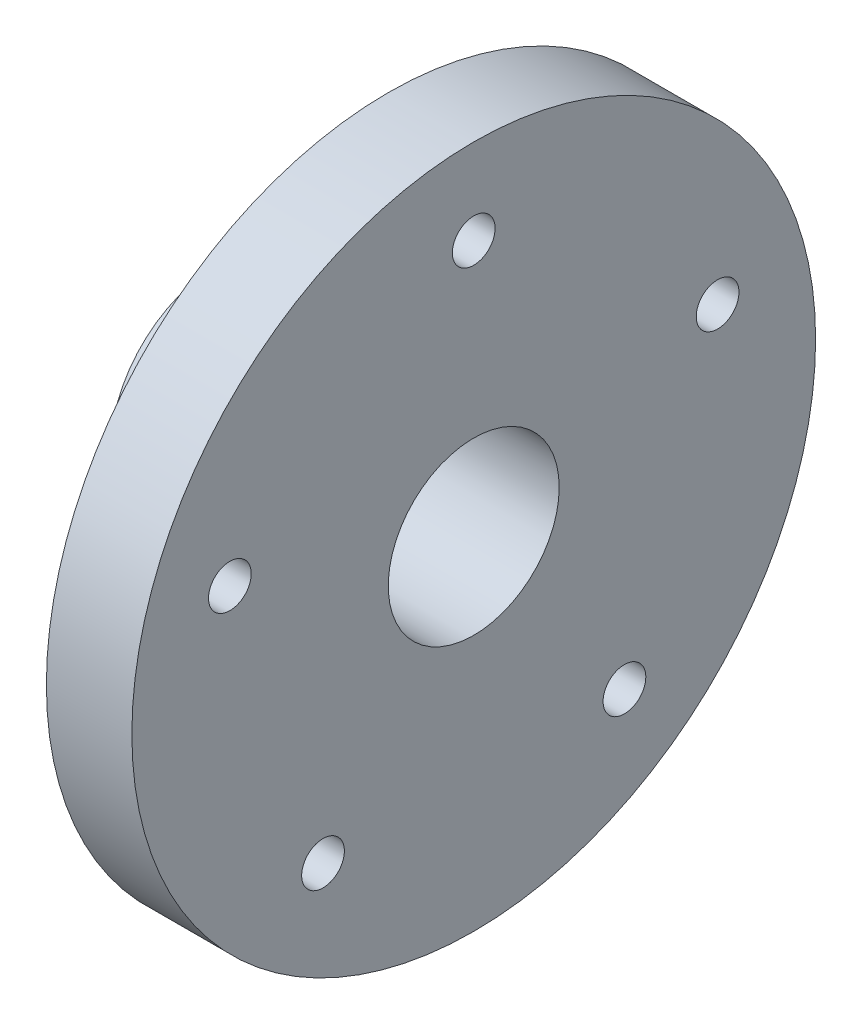
ISO-10303-21;
HEADER;
FILE_DESCRIPTION(('STEP AP214'),'2;1');
FILE_NAME('part.step','',(''),(''),'','','');
FILE_SCHEMA(('AUTOMOTIVE_DESIGN { 1 0 10303 214 1 1 1 1 }'));
ENDSEC;
DATA;
#1=APPLICATION_CONTEXT('core data for automotive mechanical design processes');
#2=APPLICATION_PROTOCOL_DEFINITION('international standard','automotive_design',2000,#1);
#3=PRODUCT_CONTEXT('',#1,'mechanical');
#4=PRODUCT('Part','Part','',(#3));
#5=PRODUCT_RELATED_PRODUCT_CATEGORY('part','',(#4));
#6=PRODUCT_DEFINITION_FORMATION('','',#4);
#7=PRODUCT_DEFINITION_CONTEXT('part definition',#1,'design');
#8=PRODUCT_DEFINITION('design','',#6,#7);
#9=PRODUCT_DEFINITION_SHAPE('','',#8);
#10=(LENGTH_UNIT() NAMED_UNIT(*) SI_UNIT(.MILLI.,.METRE.));
#11=(NAMED_UNIT(*) PLANE_ANGLE_UNIT() SI_UNIT($,.RADIAN.));
#12=(NAMED_UNIT(*) SI_UNIT($,.STERADIAN.) SOLID_ANGLE_UNIT());
#13=UNCERTAINTY_MEASURE_WITH_UNIT(LENGTH_MEASURE(1.E-05),#10,'distance_accuracy_value','');
#14=(GEOMETRIC_REPRESENTATION_CONTEXT(3) GLOBAL_UNCERTAINTY_ASSIGNED_CONTEXT((#13)) GLOBAL_UNIT_ASSIGNED_CONTEXT((#10,
#11,#12)) REPRESENTATION_CONTEXT('',''));
#15=CARTESIAN_POINT('',(0.,0.,0.));
#16=DIRECTION('',(0.,0.,1.));
#17=DIRECTION('',(1.,0.,0.));
#18=AXIS2_PLACEMENT_3D('',#15,#16,#17);
#19=CARTESIAN_POINT('',(-1.,0.,0.));
#20=DIRECTION('',(1.,0.,0.));
#21=DIRECTION('',(0.,0.,-1.));
#22=AXIS2_PLACEMENT_3D('',#19,#20,#21);
#23=PLANE('',#22);
#24=CARTESIAN_POINT('',(-1.,-2.42705098312485,1.76335575687741));
#25=DIRECTION('',(1.,0.,0.));
#26=DIRECTION('',(0.,0.,-1.));
#27=AXIS2_PLACEMENT_3D('',#24,#25,#26);
#28=CIRCLE('',#27,0.25);
#29=CARTESIAN_POINT('',(-1.,-2.42705098312485,1.51335575687741));
#30=VERTEX_POINT('',#29);
#31=EDGE_CURVE('E68',#30,#30,#28,.T.);
#32=ORIENTED_EDGE('',*,*,#31,.T.);
#33=EDGE_LOOP('',(#32));
#34=FACE_BOUND('',#33,.T.);
#35=CARTESIAN_POINT('',(-1.,-2.42705098312483,-1.76335575687744));
#36=DIRECTION('',(1.,0.,0.));
#37=DIRECTION('',(0.,0.,-1.));
#38=AXIS2_PLACEMENT_3D('',#35,#36,#37);
#39=CIRCLE('',#38,0.25);
#40=CARTESIAN_POINT('',(-1.,-2.42705098312483,-2.01335575687744));
#41=VERTEX_POINT('',#40);
#42=EDGE_CURVE('E71',#41,#41,#39,.T.);
#43=ORIENTED_EDGE('',*,*,#42,.T.);
#44=EDGE_LOOP('',(#43));
#45=FACE_BOUND('',#44,.T.);
#46=CARTESIAN_POINT('',(-1.,0.927050983124875,-2.85316954888545));
#47=DIRECTION('',(1.,0.,0.));
#48=DIRECTION('',(0.,0.,-1.));
#49=AXIS2_PLACEMENT_3D('',#46,#47,#48);
#50=CIRCLE('',#49,0.25);
#51=CARTESIAN_POINT('',(-1.,0.927050983124875,-3.10316954888545));
#52=VERTEX_POINT('',#51);
#53=EDGE_CURVE('E74',#52,#52,#50,.T.);
#54=ORIENTED_EDGE('',*,*,#53,.T.);
#55=EDGE_LOOP('',(#54));
#56=FACE_BOUND('',#55,.T.);
#57=CARTESIAN_POINT('',(-1.,0.927050983124834,2.85316954888546));
#58=DIRECTION('',(1.,0.,0.));
#59=DIRECTION('',(0.,0.,-1.));
#60=AXIS2_PLACEMENT_3D('',#57,#58,#59);
#61=CIRCLE('',#60,0.25);
#62=CARTESIAN_POINT('',(-1.,0.927050983124834,2.60316954888546));
#63=VERTEX_POINT('',#62);
#64=EDGE_CURVE('E62',#63,#63,#61,.T.);
#65=ORIENTED_EDGE('',*,*,#64,.T.);
#66=EDGE_LOOP('',(#65));
#67=FACE_BOUND('',#66,.T.);
#68=CARTESIAN_POINT('',(-1.,3.,0.));
#69=DIRECTION('',(1.,0.,0.));
#70=DIRECTION('',(0.,0.,-1.));
#71=AXIS2_PLACEMENT_3D('',#68,#69,#70);
#72=CIRCLE('',#71,0.25);
#73=CARTESIAN_POINT('',(-1.,3.,-0.25));
#74=VERTEX_POINT('',#73);
#75=EDGE_CURVE('E56',#74,#74,#72,.T.);
#76=ORIENTED_EDGE('',*,*,#75,.T.);
#77=EDGE_LOOP('',(#76));
#78=FACE_BOUND('',#77,.T.);
#79=CARTESIAN_POINT('',(-1.,0.,0.));
#80=DIRECTION('',(1.,0.,0.));
#81=DIRECTION('',(0.,0.,-1.));
#82=AXIS2_PLACEMENT_3D('',#79,#80,#81);
#83=CIRCLE('',#82,4.);
#84=CARTESIAN_POINT('',(-1.,0.,-4.));
#85=VERTEX_POINT('',#84);
#86=EDGE_CURVE('E37',#85,#85,#83,.T.);
#87=ORIENTED_EDGE('',*,*,#86,.F.);
#88=EDGE_LOOP('',(#87));
#89=FACE_BOUND('',#88,.T.);
#90=CARTESIAN_POINT('',(-1.,0.,0.));
#91=DIRECTION('',(1.,0.,0.));
#92=DIRECTION('',(0.,0.,-1.));
#93=AXIS2_PLACEMENT_3D('',#90,#91,#92);
#94=CIRCLE('',#93,1.25);
#95=CARTESIAN_POINT('',(-1.,0.,-1.25));
#96=VERTEX_POINT('',#95);
#97=EDGE_CURVE('E10',#96,#96,#94,.F.);
#98=ORIENTED_EDGE('',*,*,#97,.F.);
#99=EDGE_LOOP('',(#98));
#100=FACE_BOUND('',#99,.T.);
#101=ADVANCED_FACE('F30',(#34,#45,#56,#67,#78,#89,#100),#23,.F.);
#102=CARTESIAN_POINT('',(-1.,0.,0.));
#103=DIRECTION('',(1.,0.,0.));
#104=DIRECTION('',(0.,0.,-1.));
#105=AXIS2_PLACEMENT_3D('',#102,#103,#104);
#106=CYLINDRICAL_SURFACE('',#105,4.);
#107=ORIENTED_EDGE('',*,*,#86,.T.);
#108=EDGE_LOOP('',(#107));
#109=FACE_BOUND('',#108,.T.);
#110=CARTESIAN_POINT('',(0.,0.,0.));
#111=DIRECTION('',(1.,0.,0.));
#112=DIRECTION('',(0.,0.,-1.));
#113=AXIS2_PLACEMENT_3D('',#110,#111,#112);
#114=CIRCLE('',#113,4.);
#115=CARTESIAN_POINT('',(0.,0.,-4.));
#116=VERTEX_POINT('',#115);
#117=EDGE_CURVE('E41',#116,#116,#114,.T.);
#118=ORIENTED_EDGE('',*,*,#117,.F.);
#119=EDGE_LOOP('',(#118));
#120=FACE_BOUND('',#119,.T.);
#121=ADVANCED_FACE('F32',(#109,#120),#106,.T.);
#122=CARTESIAN_POINT('',(0.,0.,0.));
#123=DIRECTION('',(1.,0.,0.));
#124=DIRECTION('',(0.,0.,-1.));
#125=AXIS2_PLACEMENT_3D('',#122,#123,#124);
#126=PLANE('',#125);
#127=CARTESIAN_POINT('',(0.,-2.42705098312485,1.76335575687741));
#128=DIRECTION('',(1.,0.,0.));
#129=DIRECTION('',(0.,0.587785252292469,0.809016994374951));
#130=AXIS2_PLACEMENT_3D('',#127,#128,#129);
#131=CIRCLE('',#130,0.25);
#132=CARTESIAN_POINT('',(0.,-2.28010467005174,1.96561000547114));
#133=VERTEX_POINT('',#132);
#134=EDGE_CURVE('E77',#133,#133,#131,.T.);
#135=ORIENTED_EDGE('',*,*,#134,.F.);
#136=EDGE_LOOP('',(#135));
#137=FACE_BOUND('',#136,.T.);
#138=CARTESIAN_POINT('',(0.,-2.42705098312483,-1.76335575687744));
#139=DIRECTION('',(1.,0.,0.));
#140=DIRECTION('',(0.,-0.58778525229248,0.809016994374942));
#141=AXIS2_PLACEMENT_3D('',#138,#139,#140);
#142=CIRCLE('',#141,0.25);
#143=CARTESIAN_POINT('',(0.,-2.57399729619795,-1.56110150828371));
#144=VERTEX_POINT('',#143);
#145=EDGE_CURVE('E81',#144,#144,#142,.T.);
#146=ORIENTED_EDGE('',*,*,#145,.F.);
#147=EDGE_LOOP('',(#146));
#148=FACE_BOUND('',#147,.T.);
#149=CARTESIAN_POINT('',(0.,0.927050983124875,-2.85316954888545));
#150=DIRECTION('',(1.,0.,0.));
#151=DIRECTION('',(0.,-0.95105651629515,-0.309016994374958));
#152=AXIS2_PLACEMENT_3D('',#149,#150,#151);
#153=CIRCLE('',#152,0.25);
#154=CARTESIAN_POINT('',(0.,0.689286854051087,-2.93042379747919));
#155=VERTEX_POINT('',#154);
#156=EDGE_CURVE('E78',#155,#155,#153,.T.);
#157=ORIENTED_EDGE('',*,*,#156,.F.);
#158=EDGE_LOOP('',(#157));
#159=FACE_BOUND('',#158,.T.);
#160=CARTESIAN_POINT('',(0.,0.927050983124834,2.85316954888546));
#161=DIRECTION('',(1.,0.,0.));
#162=DIRECTION('',(0.,0.951056516295155,-0.309016994374945));
#163=AXIS2_PLACEMENT_3D('',#160,#161,#162);
#164=CIRCLE('',#163,0.25);
#165=CARTESIAN_POINT('',(0.,1.16481511219862,2.77591530029173));
#166=VERTEX_POINT('',#165);
#167=EDGE_CURVE('E65',#166,#166,#164,.T.);
#168=ORIENTED_EDGE('',*,*,#167,.F.);
#169=EDGE_LOOP('',(#168));
#170=FACE_BOUND('',#169,.T.);
#171=CARTESIAN_POINT('',(0.,3.,0.));
#172=DIRECTION('',(1.,0.,0.));
#173=DIRECTION('',(0.,0.,-1.));
#174=AXIS2_PLACEMENT_3D('',#171,#172,#173);
#175=CIRCLE('',#174,0.25);
#176=CARTESIAN_POINT('',(0.,3.,-0.25));
#177=VERTEX_POINT('',#176);
#178=EDGE_CURVE('E59',#177,#177,#175,.T.);
#179=ORIENTED_EDGE('',*,*,#178,.F.);
#180=EDGE_LOOP('',(#179));
#181=FACE_BOUND('',#180,.T.);
#182=CARTESIAN_POINT('',(0.,0.,0.));
#183=DIRECTION('',(1.,0.,0.));
#184=DIRECTION('',(0.,0.,-1.));
#185=AXIS2_PLACEMENT_3D('',#182,#183,#184);
#186=CIRCLE('',#185,1.);
#187=CARTESIAN_POINT('',(0.,0.,-1.));
#188=VERTEX_POINT('',#187);
#189=EDGE_CURVE('E46',#188,#188,#186,.T.);
#190=ORIENTED_EDGE('',*,*,#189,.F.);
#191=EDGE_LOOP('',(#190));
#192=FACE_BOUND('',#191,.T.);
#193=ORIENTED_EDGE('',*,*,#117,.T.);
#194=EDGE_LOOP('',(#193));
#195=FACE_BOUND('',#194,.T.);
#196=ADVANCED_FACE('F90',(#137,#148,#159,#170,#181,#192,#195),#126,.T.);
#197=CARTESIAN_POINT('',(-2.5,0.,0.));
#198=DIRECTION('',(1.,0.,0.));
#199=DIRECTION('',(0.,0.,-1.));
#200=AXIS2_PLACEMENT_3D('',#197,#198,#199);
#201=CYLINDRICAL_SURFACE('',#200,1.);
#202=ORIENTED_EDGE('',*,*,#189,.T.);
#203=EDGE_LOOP('',(#202));
#204=FACE_BOUND('',#203,.T.);
#205=CARTESIAN_POINT('',(-3.,0.,0.));
#206=DIRECTION('',(-1.,0.,0.));
#207=DIRECTION('',(0.,0.,1.));
#208=AXIS2_PLACEMENT_3D('',#205,#206,#207);
#209=CIRCLE('',#208,1.);
#210=CARTESIAN_POINT('',(-3.,0.,1.));
#211=VERTEX_POINT('',#210);
#212=EDGE_CURVE('E53',#211,#211,#209,.T.);
#213=ORIENTED_EDGE('',*,*,#212,.T.);
#214=EDGE_LOOP('',(#213));
#215=FACE_BOUND('',#214,.T.);
#216=ADVANCED_FACE('F93',(#204,#215),#201,.F.);
#217=CARTESIAN_POINT('',(-3.,0.,0.));
#218=DIRECTION('',(-1.,0.,0.));
#219=DIRECTION('',(0.,0.,1.));
#220=AXIS2_PLACEMENT_3D('',#217,#218,#219);
#221=PLANE('',#220);
#222=CARTESIAN_POINT('',(-3.,0.,0.));
#223=DIRECTION('',(-1.,0.,0.));
#224=DIRECTION('',(0.,0.,1.));
#225=AXIS2_PLACEMENT_3D('',#222,#223,#224);
#226=CIRCLE('',#225,1.25);
#227=CARTESIAN_POINT('',(-3.,0.,1.25));
#228=VERTEX_POINT('',#227);
#229=EDGE_CURVE('E50',#228,#228,#226,.T.);
#230=ORIENTED_EDGE('',*,*,#229,.T.);
#231=EDGE_LOOP('',(#230));
#232=FACE_BOUND('',#231,.T.);
#233=ORIENTED_EDGE('',*,*,#212,.F.);
#234=EDGE_LOOP('',(#233));
#235=FACE_BOUND('',#234,.T.);
#236=ADVANCED_FACE('F118',(#232,#235),#221,.T.);
#237=CARTESIAN_POINT('',(-3.,0.,0.));
#238=DIRECTION('',(1.,0.,0.));
#239=DIRECTION('',(0.,0.,-1.));
#240=AXIS2_PLACEMENT_3D('',#237,#238,#239);
#241=CYLINDRICAL_SURFACE('',#240,1.25);
#242=ORIENTED_EDGE('',*,*,#229,.F.);
#243=EDGE_LOOP('',(#242));
#244=FACE_BOUND('',#243,.T.);
#245=ORIENTED_EDGE('',*,*,#97,.T.);
#246=EDGE_LOOP('',(#245));
#247=FACE_BOUND('',#246,.T.);
#248=ADVANCED_FACE('F120',(#244,#247),#241,.T.);
#249=CARTESIAN_POINT('',(-2.,3.,0.));
#250=DIRECTION('',(1.,0.,0.));
#251=DIRECTION('',(0.,0.,-1.));
#252=AXIS2_PLACEMENT_3D('',#249,#250,#251);
#253=CYLINDRICAL_SURFACE('',#252,0.25);
#254=ORIENTED_EDGE('',*,*,#178,.T.);
#255=EDGE_LOOP('',(#254));
#256=FACE_BOUND('',#255,.T.);
#257=ORIENTED_EDGE('',*,*,#75,.F.);
#258=EDGE_LOOP('',(#257));
#259=FACE_BOUND('',#258,.T.);
#260=ADVANCED_FACE('F123',(#256,#259),#253,.F.);
#261=CARTESIAN_POINT('',(-2.,0.927050983124834,2.85316954888546));
#262=DIRECTION('',(1.,0.,0.));
#263=DIRECTION('',(0.,0.,-1.));
#264=AXIS2_PLACEMENT_3D('',#261,#262,#263);
#265=CYLINDRICAL_SURFACE('',#264,0.25);
#266=ORIENTED_EDGE('',*,*,#167,.T.);
#267=EDGE_LOOP('',(#266));
#268=FACE_BOUND('',#267,.T.);
#269=ORIENTED_EDGE('',*,*,#64,.F.);
#270=EDGE_LOOP('',(#269));
#271=FACE_BOUND('',#270,.T.);
#272=ADVANCED_FACE('F130',(#268,#271),#265,.F.);
#273=CARTESIAN_POINT('',(-2.,0.927050983124875,-2.85316954888545));
#274=DIRECTION('',(1.,0.,0.));
#275=DIRECTION('',(0.,0.,-1.));
#276=AXIS2_PLACEMENT_3D('',#273,#274,#275);
#277=CYLINDRICAL_SURFACE('',#276,0.25);
#278=ORIENTED_EDGE('',*,*,#156,.T.);
#279=EDGE_LOOP('',(#278));
#280=FACE_BOUND('',#279,.T.);
#281=ORIENTED_EDGE('',*,*,#53,.F.);
#282=EDGE_LOOP('',(#281));
#283=FACE_BOUND('',#282,.T.);
#284=ADVANCED_FACE('F134',(#280,#283),#277,.F.);
#285=CARTESIAN_POINT('',(-2.,-2.42705098312483,-1.76335575687744));
#286=DIRECTION('',(1.,0.,0.));
#287=DIRECTION('',(0.,0.,-1.));
#288=AXIS2_PLACEMENT_3D('',#285,#286,#287);
#289=CYLINDRICAL_SURFACE('',#288,0.25);
#290=ORIENTED_EDGE('',*,*,#145,.T.);
#291=EDGE_LOOP('',(#290));
#292=FACE_BOUND('',#291,.T.);
#293=ORIENTED_EDGE('',*,*,#42,.F.);
#294=EDGE_LOOP('',(#293));
#295=FACE_BOUND('',#294,.T.);
#296=ADVANCED_FACE('F138',(#292,#295),#289,.F.);
#297=CARTESIAN_POINT('',(-2.,-2.42705098312485,1.76335575687741));
#298=DIRECTION('',(1.,0.,0.));
#299=DIRECTION('',(0.,0.,-1.));
#300=AXIS2_PLACEMENT_3D('',#297,#298,#299);
#301=CYLINDRICAL_SURFACE('',#300,0.25);
#302=ORIENTED_EDGE('',*,*,#134,.T.);
#303=EDGE_LOOP('',(#302));
#304=FACE_BOUND('',#303,.T.);
#305=ORIENTED_EDGE('',*,*,#31,.F.);
#306=EDGE_LOOP('',(#305));
#307=FACE_BOUND('',#306,.T.);
#308=ADVANCED_FACE('F87',(#304,#307),#301,.F.);
#309=CLOSED_SHELL('',(#101,#121,#196,#216,#236,#248,#260,#272,#284,#296,#308));
#310=MANIFOLD_SOLID_BREP('B2',#309);
#311=ADVANCED_BREP_SHAPE_REPRESENTATION('',(#18,#310),#14);
#312=SHAPE_DEFINITION_REPRESENTATION(#9,#311);
ENDSEC;
END-ISO-10303-21;
